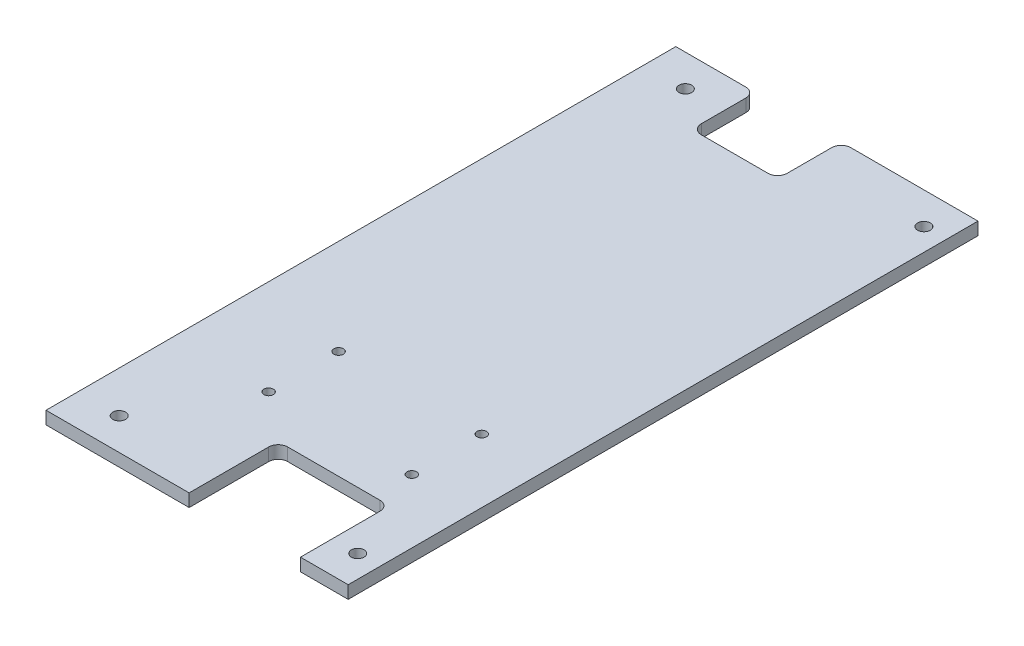
ISO-10303-21;
HEADER;
FILE_DESCRIPTION(('STEP AP214'),'2;1');
FILE_NAME('part.step','',(''),(''),'','','');
FILE_SCHEMA(('AUTOMOTIVE_DESIGN { 1 0 10303 214 1 1 1 1 }'));
ENDSEC;
DATA;
#1=APPLICATION_CONTEXT('core data for automotive mechanical design processes');
#2=APPLICATION_PROTOCOL_DEFINITION('international standard','automotive_design',2000,#1);
#3=PRODUCT_CONTEXT('',#1,'mechanical');
#4=PRODUCT('Part','Part','',(#3));
#5=PRODUCT_RELATED_PRODUCT_CATEGORY('part','',(#4));
#6=PRODUCT_DEFINITION_FORMATION('','',#4);
#7=PRODUCT_DEFINITION_CONTEXT('part definition',#1,'design');
#8=PRODUCT_DEFINITION('design','',#6,#7);
#9=PRODUCT_DEFINITION_SHAPE('','',#8);
#10=(LENGTH_UNIT() NAMED_UNIT(*) SI_UNIT(.MILLI.,.METRE.));
#11=(NAMED_UNIT(*) PLANE_ANGLE_UNIT() SI_UNIT($,.RADIAN.));
#12=(NAMED_UNIT(*) SI_UNIT($,.STERADIAN.) SOLID_ANGLE_UNIT());
#13=UNCERTAINTY_MEASURE_WITH_UNIT(LENGTH_MEASURE(1.E-05),#10,'distance_accuracy_value','');
#14=(GEOMETRIC_REPRESENTATION_CONTEXT(3) GLOBAL_UNCERTAINTY_ASSIGNED_CONTEXT((#13)) GLOBAL_UNIT_ASSIGNED_CONTEXT((#10,
#11,#12)) REPRESENTATION_CONTEXT('',''));
#15=CARTESIAN_POINT('',(0.,0.,0.));
#16=DIRECTION('',(0.,0.,1.));
#17=DIRECTION('',(1.,0.,0.));
#18=AXIS2_PLACEMENT_3D('',#15,#16,#17);
#19=CARTESIAN_POINT('',(47.5,4.,-99.));
#20=DIRECTION('',(0.,0.,1.));
#21=DIRECTION('',(1.,0.,0.));
#22=AXIS2_PLACEMENT_3D('',#19,#20,#21);
#23=PLANE('',#22);
#24=DIRECTION('',(-1.,0.,0.));
#25=VECTOR('',#24,1.);
#26=CARTESIAN_POINT('',(47.5,0.,-99.));
#27=LINE('',#26,#25);
#28=CARTESIAN_POINT('',(47.5,0.,-99.));
#29=VERTEX_POINT('',#28);
#30=CARTESIAN_POINT('',(7.50000000000001,0.,-99.));
#31=VERTEX_POINT('',#30);
#32=EDGE_CURVE('E209',#29,#31,#27,.T.);
#33=ORIENTED_EDGE('',*,*,#32,.T.);
#34=DIRECTION('',(0.,1.,0.));
#35=VECTOR('',#34,1.);
#36=CARTESIAN_POINT('',(7.50000000000001,4.,-99.));
#37=LINE('',#36,#35);
#38=CARTESIAN_POINT('',(7.50000000000001,4.,-99.));
#39=VERTEX_POINT('',#38);
#40=EDGE_CURVE('E294',#31,#39,#37,.T.);
#41=ORIENTED_EDGE('',*,*,#40,.T.);
#42=DIRECTION('',(-1.,0.,0.));
#43=VECTOR('',#42,1.);
#44=CARTESIAN_POINT('',(47.5,4.,-99.));
#45=LINE('',#44,#43);
#46=CARTESIAN_POINT('',(47.5,4.,-99.));
#47=VERTEX_POINT('',#46);
#48=EDGE_CURVE('E218',#47,#39,#45,.T.);
#49=ORIENTED_EDGE('',*,*,#48,.F.);
#50=DIRECTION('',(0.,-1.,0.));
#51=VECTOR('',#50,1.);
#52=CARTESIAN_POINT('',(47.5,4.,-99.));
#53=LINE('',#52,#51);
#54=EDGE_CURVE('E217',#47,#29,#53,.T.);
#55=ORIENTED_EDGE('',*,*,#54,.T.);
#56=EDGE_LOOP('',(#33,#41,#49,#55));
#57=FACE_BOUND('',#56,.T.);
#58=ADVANCED_FACE('F39',(#57),#23,.F.);
#59=CARTESIAN_POINT('',(47.5,4.,99.));
#60=DIRECTION('',(0.,0.,-1.));
#61=DIRECTION('',(-1.,0.,0.));
#62=AXIS2_PLACEMENT_3D('',#59,#60,#61);
#63=PLANE('',#62);
#64=DIRECTION('',(1.,0.,0.));
#65=VECTOR('',#64,1.);
#66=CARTESIAN_POINT('',(47.5,0.,99.));
#67=LINE('',#66,#65);
#68=CARTESIAN_POINT('',(-47.5,0.,99.));
#69=VERTEX_POINT('',#68);
#70=CARTESIAN_POINT('',(-2.50000000000001,0.,99.));
#71=VERTEX_POINT('',#70);
#72=EDGE_CURVE('E196',#69,#71,#67,.T.);
#73=ORIENTED_EDGE('',*,*,#72,.T.);
#74=DIRECTION('',(0.,1.,0.));
#75=VECTOR('',#74,1.);
#76=CARTESIAN_POINT('',(-2.50000000000001,0.,99.));
#77=LINE('',#76,#75);
#78=CARTESIAN_POINT('',(-2.50000000000001,4.,99.));
#79=VERTEX_POINT('',#78);
#80=EDGE_CURVE('E188',#71,#79,#77,.T.);
#81=ORIENTED_EDGE('',*,*,#80,.T.);
#82=DIRECTION('',(1.,0.,0.));
#83=VECTOR('',#82,1.);
#84=CARTESIAN_POINT('',(47.5,4.,99.));
#85=LINE('',#84,#83);
#86=CARTESIAN_POINT('',(-47.5,4.,99.));
#87=VERTEX_POINT('',#86);
#88=EDGE_CURVE('E404',#87,#79,#85,.T.);
#89=ORIENTED_EDGE('',*,*,#88,.F.);
#90=DIRECTION('',(0.,-1.,0.));
#91=VECTOR('',#90,1.);
#92=CARTESIAN_POINT('',(-47.5,4.,99.));
#93=LINE('',#92,#91);
#94=EDGE_CURVE('E225',#87,#69,#93,.T.);
#95=ORIENTED_EDGE('',*,*,#94,.T.);
#96=EDGE_LOOP('',(#73,#81,#89,#95));
#97=FACE_BOUND('',#96,.T.);
#98=ADVANCED_FACE('F426',(#97),#63,.F.);
#99=CARTESIAN_POINT('',(-47.5,4.,99.));
#100=DIRECTION('',(1.,0.,0.));
#101=DIRECTION('',(0.,0.,-1.));
#102=AXIS2_PLACEMENT_3D('',#99,#100,#101);
#103=PLANE('',#102);
#104=DIRECTION('',(0.,0.,1.));
#105=VECTOR('',#104,1.);
#106=CARTESIAN_POINT('',(-47.5,0.,99.));
#107=LINE('',#106,#105);
#108=CARTESIAN_POINT('',(-47.5,0.,-99.));
#109=VERTEX_POINT('',#108);
#110=EDGE_CURVE('E197',#109,#69,#107,.T.);
#111=ORIENTED_EDGE('',*,*,#110,.T.);
#112=ORIENTED_EDGE('',*,*,#94,.F.);
#113=DIRECTION('',(0.,0.,1.));
#114=VECTOR('',#113,1.);
#115=CARTESIAN_POINT('',(-47.5,4.,99.));
#116=LINE('',#115,#114);
#117=CARTESIAN_POINT('',(-47.5,4.,-99.));
#118=VERTEX_POINT('',#117);
#119=EDGE_CURVE('E212',#118,#87,#116,.T.);
#120=ORIENTED_EDGE('',*,*,#119,.F.);
#121=DIRECTION('',(0.,-1.,0.));
#122=VECTOR('',#121,1.);
#123=CARTESIAN_POINT('',(-47.5,4.,-99.));
#124=LINE('',#123,#122);
#125=EDGE_CURVE('E213',#118,#109,#124,.T.);
#126=ORIENTED_EDGE('',*,*,#125,.T.);
#127=EDGE_LOOP('',(#111,#112,#120,#126));
#128=FACE_BOUND('',#127,.T.);
#129=ADVANCED_FACE('F424',(#128),#103,.F.);
#130=CARTESIAN_POINT('',(32.5,4.,99.));
#131=VERTEX_POINT('',#130);
#132=CARTESIAN_POINT('',(47.5,4.,99.));
#133=VERTEX_POINT('',#132);
#134=EDGE_CURVE('E186',#131,#133,#85,.T.);
#135=ORIENTED_EDGE('',*,*,#134,.F.);
#136=DIRECTION('',(0.,1.,0.));
#137=VECTOR('',#136,1.);
#138=CARTESIAN_POINT('',(32.5,0.,99.));
#139=LINE('',#138,#137);
#140=CARTESIAN_POINT('',(32.5,0.,99.));
#141=VERTEX_POINT('',#140);
#142=EDGE_CURVE('E170',#141,#131,#139,.T.);
#143=ORIENTED_EDGE('',*,*,#142,.F.);
#144=CARTESIAN_POINT('',(47.5,0.,99.));
#145=VERTEX_POINT('',#144);
#146=EDGE_CURVE('E184',#141,#145,#67,.T.);
#147=ORIENTED_EDGE('',*,*,#146,.T.);
#148=DIRECTION('',(0.,-1.,0.));
#149=VECTOR('',#148,1.);
#150=CARTESIAN_POINT('',(47.5,4.,99.));
#151=LINE('',#150,#149);
#152=EDGE_CURVE('E222',#133,#145,#151,.T.);
#153=ORIENTED_EDGE('',*,*,#152,.F.);
#154=EDGE_LOOP('',(#135,#143,#147,#153));
#155=FACE_BOUND('',#154,.T.);
#156=ADVANCED_FACE('F182',(#155),#63,.F.);
#157=CARTESIAN_POINT('',(47.5,4.,99.));
#158=DIRECTION('',(-1.,0.,0.));
#159=DIRECTION('',(0.,0.,1.));
#160=AXIS2_PLACEMENT_3D('',#157,#158,#159);
#161=PLANE('',#160);
#162=DIRECTION('',(0.,0.,-1.));
#163=VECTOR('',#162,1.);
#164=CARTESIAN_POINT('',(47.5,0.,99.));
#165=LINE('',#164,#163);
#166=EDGE_CURVE('E194',#145,#29,#165,.T.);
#167=ORIENTED_EDGE('',*,*,#166,.T.);
#168=ORIENTED_EDGE('',*,*,#54,.F.);
#169=DIRECTION('',(0.,0.,-1.));
#170=VECTOR('',#169,1.);
#171=CARTESIAN_POINT('',(47.5,4.,99.));
#172=LINE('',#171,#170);
#173=EDGE_CURVE('E408',#133,#47,#172,.T.);
#174=ORIENTED_EDGE('',*,*,#173,.F.);
#175=ORIENTED_EDGE('',*,*,#152,.T.);
#176=EDGE_LOOP('',(#167,#168,#174,#175));
#177=FACE_BOUND('',#176,.T.);
#178=ADVANCED_FACE('F448',(#177),#161,.F.);
#179=CARTESIAN_POINT('',(-25.5,4.,-99.));
#180=VERTEX_POINT('',#179);
#181=EDGE_CURVE('E410',#180,#118,#45,.T.);
#182=ORIENTED_EDGE('',*,*,#181,.F.);
#183=DIRECTION('',(0.,1.,0.));
#184=VECTOR('',#183,1.);
#185=CARTESIAN_POINT('',(-25.5,4.,-99.));
#186=LINE('',#185,#184);
#187=CARTESIAN_POINT('',(-25.5,0.,-99.));
#188=VERTEX_POINT('',#187);
#189=EDGE_CURVE('E286',#180,#188,#186,.F.);
#190=ORIENTED_EDGE('',*,*,#189,.T.);
#191=EDGE_CURVE('E208',#188,#109,#27,.T.);
#192=ORIENTED_EDGE('',*,*,#191,.T.);
#193=ORIENTED_EDGE('',*,*,#125,.F.);
#194=EDGE_LOOP('',(#182,#190,#192,#193));
#195=FACE_BOUND('',#194,.T.);
#196=ADVANCED_FACE('F421',(#195),#23,.F.);
#197=CARTESIAN_POINT('',(0.,4.,0.));
#198=DIRECTION('',(0.,1.,0.));
#199=DIRECTION('',(0.,0.,1.));
#200=AXIS2_PLACEMENT_3D('',#197,#198,#199);
#201=PLANE('',#200);
#202=CARTESIAN_POINT('',(27.5,4.,59.));
#203=DIRECTION('',(0.,1.,0.));
#204=DIRECTION('',(0.,0.,1.));
#205=AXIS2_PLACEMENT_3D('',#202,#203,#204);
#206=CIRCLE('',#205,1.5);
#207=CARTESIAN_POINT('',(27.5,4.,60.5));
#208=VERTEX_POINT('',#207);
#209=EDGE_CURVE('E241',#208,#208,#206,.T.);
#210=ORIENTED_EDGE('',*,*,#209,.F.);
#211=EDGE_LOOP('',(#210));
#212=FACE_BOUND('',#211,.T.);
#213=CARTESIAN_POINT('',(27.5,4.,37.));
#214=DIRECTION('',(0.,1.,0.));
#215=DIRECTION('',(0.,0.,1.));
#216=AXIS2_PLACEMENT_3D('',#213,#214,#215);
#217=CIRCLE('',#216,1.5);
#218=CARTESIAN_POINT('',(27.5,4.,38.5));
#219=VERTEX_POINT('',#218);
#220=EDGE_CURVE('E726',#219,#219,#217,.T.);
#221=ORIENTED_EDGE('',*,*,#220,.F.);
#222=EDGE_LOOP('',(#221));
#223=FACE_BOUND('',#222,.T.);
#224=CARTESIAN_POINT('',(-17.5,4.,37.));
#225=DIRECTION('',(0.,1.,0.));
#226=DIRECTION('',(0.,0.,1.));
#227=AXIS2_PLACEMENT_3D('',#224,#225,#226);
#228=CIRCLE('',#227,1.5);
#229=CARTESIAN_POINT('',(-17.5,4.,38.5));
#230=VERTEX_POINT('',#229);
#231=EDGE_CURVE('E714',#230,#230,#228,.T.);
#232=ORIENTED_EDGE('',*,*,#231,.F.);
#233=EDGE_LOOP('',(#232));
#234=FACE_BOUND('',#233,.T.);
#235=CARTESIAN_POINT('',(-17.5,4.,59.));
#236=DIRECTION('',(0.,1.,0.));
#237=DIRECTION('',(0.,0.,1.));
#238=AXIS2_PLACEMENT_3D('',#235,#236,#237);
#239=CIRCLE('',#238,1.5);
#240=CARTESIAN_POINT('',(-17.5,4.,60.5));
#241=VERTEX_POINT('',#240);
#242=EDGE_CURVE('E235',#241,#241,#239,.T.);
#243=ORIENTED_EDGE('',*,*,#242,.F.);
#244=EDGE_LOOP('',(#243));
#245=FACE_BOUND('',#244,.T.);
#246=DIRECTION('',(0.,0.,1.));
#247=VECTOR('',#246,1.);
#248=CARTESIAN_POINT('',(-22.5,4.,-99.));
#249=LINE('',#248,#247);
#250=CARTESIAN_POINT('',(-22.5,4.,-96.));
#251=VERTEX_POINT('',#250);
#252=CARTESIAN_POINT('',(-22.5,4.,-82.));
#253=VERTEX_POINT('',#252);
#254=EDGE_CURVE('E234',#251,#253,#249,.T.);
#255=ORIENTED_EDGE('',*,*,#254,.F.);
#256=CARTESIAN_POINT('',(-25.5,4.,-96.));
#257=DIRECTION('',(0.,1.,0.));
#258=DIRECTION('',(0.,0.,1.));
#259=AXIS2_PLACEMENT_3D('',#256,#257,#258);
#260=CIRCLE('',#259,3.);
#261=EDGE_CURVE('E283',#251,#180,#260,.T.);
#262=ORIENTED_EDGE('',*,*,#261,.T.);
#263=ORIENTED_EDGE('',*,*,#181,.T.);
#264=ORIENTED_EDGE('',*,*,#119,.T.);
#265=ORIENTED_EDGE('',*,*,#88,.T.);
#266=DIRECTION('',(0.,0.,1.));
#267=VECTOR('',#266,1.);
#268=CARTESIAN_POINT('',(-2.50000000000001,4.,71.));
#269=LINE('',#268,#267);
#270=CARTESIAN_POINT('',(-2.50000000000001,4.,74.));
#271=VERTEX_POINT('',#270);
#272=EDGE_CURVE('E178',#271,#79,#269,.T.);
#273=ORIENTED_EDGE('',*,*,#272,.F.);
#274=CARTESIAN_POINT('',(0.499999999999991,4.,74.));
#275=DIRECTION('',(0.,1.,0.));
#276=DIRECTION('',(0.,0.,1.));
#277=AXIS2_PLACEMENT_3D('',#274,#275,#276);
#278=CIRCLE('',#277,3.);
#279=CARTESIAN_POINT('',(0.499999999999994,4.,71.));
#280=VERTEX_POINT('',#279);
#281=EDGE_CURVE('E267',#271,#280,#278,.F.);
#282=ORIENTED_EDGE('',*,*,#281,.T.);
#283=DIRECTION('',(-1.,0.,0.));
#284=VECTOR('',#283,1.);
#285=CARTESIAN_POINT('',(32.5,4.,71.));
#286=LINE('',#285,#284);
#287=CARTESIAN_POINT('',(29.5,4.,71.));
#288=VERTEX_POINT('',#287);
#289=EDGE_CURVE('E392',#288,#280,#286,.T.);
#290=ORIENTED_EDGE('',*,*,#289,.F.);
#291=CARTESIAN_POINT('',(29.5,4.,74.));
#292=DIRECTION('',(0.,1.,0.));
#293=DIRECTION('',(0.,0.,1.));
#294=AXIS2_PLACEMENT_3D('',#291,#292,#293);
#295=CIRCLE('',#294,3.);
#296=CARTESIAN_POINT('',(32.5,4.,74.));
#297=VERTEX_POINT('',#296);
#298=EDGE_CURVE('E261',#288,#297,#295,.F.);
#299=ORIENTED_EDGE('',*,*,#298,.T.);
#300=DIRECTION('',(0.,0.,-1.));
#301=VECTOR('',#300,1.);
#302=CARTESIAN_POINT('',(32.5,4.,99.));
#303=LINE('',#302,#301);
#304=EDGE_CURVE('E381',#131,#297,#303,.T.);
#305=ORIENTED_EDGE('',*,*,#304,.F.);
#306=ORIENTED_EDGE('',*,*,#134,.T.);
#307=ORIENTED_EDGE('',*,*,#173,.T.);
#308=ORIENTED_EDGE('',*,*,#48,.T.);
#309=CARTESIAN_POINT('',(7.50000000000001,4.,-96.));
#310=DIRECTION('',(0.,1.,0.));
#311=DIRECTION('',(0.,0.,1.));
#312=AXIS2_PLACEMENT_3D('',#309,#310,#311);
#313=CIRCLE('',#312,3.);
#314=CARTESIAN_POINT('',(4.5,4.,-96.));
#315=VERTEX_POINT('',#314);
#316=EDGE_CURVE('E280',#39,#315,#313,.T.);
#317=ORIENTED_EDGE('',*,*,#316,.T.);
#318=DIRECTION('',(0.,0.,-1.));
#319=VECTOR('',#318,1.);
#320=CARTESIAN_POINT('',(4.5,4.,-79.));
#321=LINE('',#320,#319);
#322=CARTESIAN_POINT('',(4.5,4.,-82.));
#323=VERTEX_POINT('',#322);
#324=EDGE_CURVE('E325',#323,#315,#321,.T.);
#325=ORIENTED_EDGE('',*,*,#324,.F.);
#326=CARTESIAN_POINT('',(1.5,4.,-82.));
#327=DIRECTION('',(0.,1.,0.));
#328=DIRECTION('',(0.,0.,1.));
#329=AXIS2_PLACEMENT_3D('',#326,#327,#328);
#330=CIRCLE('',#329,3.);
#331=CARTESIAN_POINT('',(1.5,4.,-79.));
#332=VERTEX_POINT('',#331);
#333=EDGE_CURVE('E48',#323,#332,#330,.F.);
#334=ORIENTED_EDGE('',*,*,#333,.T.);
#335=DIRECTION('',(1.,0.,0.));
#336=VECTOR('',#335,1.);
#337=CARTESIAN_POINT('',(-22.5,4.,-79.));
#338=LINE('',#337,#336);
#339=CARTESIAN_POINT('',(-19.5,4.,-79.));
#340=VERTEX_POINT('',#339);
#341=EDGE_CURVE('E324',#340,#332,#338,.T.);
#342=ORIENTED_EDGE('',*,*,#341,.F.);
#343=CARTESIAN_POINT('',(-19.5,4.,-82.));
#344=DIRECTION('',(0.,1.,0.));
#345=DIRECTION('',(0.,0.,1.));
#346=AXIS2_PLACEMENT_3D('',#343,#344,#345);
#347=CIRCLE('',#346,3.);
#348=EDGE_CURVE('E311',#340,#253,#347,.F.);
#349=ORIENTED_EDGE('',*,*,#348,.T.);
#350=EDGE_LOOP('',(#255,#262,#263,#264,#265,#273,#282,#290,#299,#305,#306,#307,#308,#317,#325,
#334,#342,#349));
#351=FACE_BOUND('',#350,.T.);
#352=CARTESIAN_POINT('',(-34.5,4.,-89.));
#353=DIRECTION('',(0.,1.,0.));
#354=DIRECTION('',(0.,0.,1.));
#355=AXIS2_PLACEMENT_3D('',#352,#353,#354);
#356=CIRCLE('',#355,2.);
#357=CARTESIAN_POINT('',(-34.5,4.,-87.));
#358=VERTEX_POINT('',#357);
#359=EDGE_CURVE('E362',#358,#358,#356,.T.);
#360=ORIENTED_EDGE('',*,*,#359,.F.);
#361=EDGE_LOOP('',(#360));
#362=FACE_BOUND('',#361,.T.);
#363=CARTESIAN_POINT('',(-34.5,4.,89.));
#364=DIRECTION('',(0.,1.,0.));
#365=DIRECTION('',(0.,0.,1.));
#366=AXIS2_PLACEMENT_3D('',#363,#364,#365);
#367=CIRCLE('',#366,2.);
#368=CARTESIAN_POINT('',(-34.5,4.,91.));
#369=VERTEX_POINT('',#368);
#370=EDGE_CURVE('E341',#369,#369,#367,.T.);
#371=ORIENTED_EDGE('',*,*,#370,.F.);
#372=EDGE_LOOP('',(#371));
#373=FACE_BOUND('',#372,.T.);
#374=CARTESIAN_POINT('',(40.5,4.,-89.));
#375=DIRECTION('',(0.,1.,0.));
#376=DIRECTION('',(0.,0.,1.));
#377=AXIS2_PLACEMENT_3D('',#374,#375,#376);
#378=CIRCLE('',#377,2.);
#379=CARTESIAN_POINT('',(40.5,4.,-87.));
#380=VERTEX_POINT('',#379);
#381=EDGE_CURVE('E361',#380,#380,#378,.T.);
#382=ORIENTED_EDGE('',*,*,#381,.F.);
#383=EDGE_LOOP('',(#382));
#384=FACE_BOUND('',#383,.T.);
#385=CARTESIAN_POINT('',(40.5,4.,89.));
#386=DIRECTION('',(0.,1.,0.));
#387=DIRECTION('',(0.,0.,1.));
#388=AXIS2_PLACEMENT_3D('',#385,#386,#387);
#389=CIRCLE('',#388,2.);
#390=CARTESIAN_POINT('',(40.5,4.,91.));
#391=VERTEX_POINT('',#390);
#392=EDGE_CURVE('E373',#391,#391,#389,.T.);
#393=ORIENTED_EDGE('',*,*,#392,.F.);
#394=EDGE_LOOP('',(#393));
#395=FACE_BOUND('',#394,.T.);
#396=ADVANCED_FACE('F322',(#212,#223,#234,#245,#351,#362,#373,#384,#395),#201,.T.);
#397=CARTESIAN_POINT('',(0.,0.,0.));
#398=DIRECTION('',(0.,1.,0.));
#399=DIRECTION('',(0.,0.,1.));
#400=AXIS2_PLACEMENT_3D('',#397,#398,#399);
#401=PLANE('',#400);
#402=CARTESIAN_POINT('',(27.5,0.,59.));
#403=DIRECTION('',(0.,1.,0.));
#404=DIRECTION('',(0.,0.,1.));
#405=AXIS2_PLACEMENT_3D('',#402,#403,#404);
#406=CIRCLE('',#405,1.5);
#407=CARTESIAN_POINT('',(27.5,0.,60.5));
#408=VERTEX_POINT('',#407);
#409=EDGE_CURVE('E245',#408,#408,#406,.T.);
#410=ORIENTED_EDGE('',*,*,#409,.T.);
#411=EDGE_LOOP('',(#410));
#412=FACE_BOUND('',#411,.T.);
#413=CARTESIAN_POINT('',(27.5,0.,37.));
#414=DIRECTION('',(0.,1.,0.));
#415=DIRECTION('',(0.,0.,1.));
#416=AXIS2_PLACEMENT_3D('',#413,#414,#415);
#417=CIRCLE('',#416,1.5);
#418=CARTESIAN_POINT('',(27.5,0.,38.5));
#419=VERTEX_POINT('',#418);
#420=EDGE_CURVE('E240',#419,#419,#417,.T.);
#421=ORIENTED_EDGE('',*,*,#420,.T.);
#422=EDGE_LOOP('',(#421));
#423=FACE_BOUND('',#422,.T.);
#424=CARTESIAN_POINT('',(-17.5,0.,37.));
#425=DIRECTION('',(0.,1.,0.));
#426=DIRECTION('',(0.,0.,1.));
#427=AXIS2_PLACEMENT_3D('',#424,#425,#426);
#428=CIRCLE('',#427,1.5);
#429=CARTESIAN_POINT('',(-17.5,0.,38.5));
#430=VERTEX_POINT('',#429);
#431=EDGE_CURVE('E236',#430,#430,#428,.T.);
#432=ORIENTED_EDGE('',*,*,#431,.T.);
#433=EDGE_LOOP('',(#432));
#434=FACE_BOUND('',#433,.T.);
#435=CARTESIAN_POINT('',(-17.5,0.,59.));
#436=DIRECTION('',(0.,1.,0.));
#437=DIRECTION('',(0.,0.,1.));
#438=AXIS2_PLACEMENT_3D('',#435,#436,#437);
#439=CIRCLE('',#438,1.5);
#440=CARTESIAN_POINT('',(-17.5,0.,60.5));
#441=VERTEX_POINT('',#440);
#442=EDGE_CURVE('E230',#441,#441,#439,.T.);
#443=ORIENTED_EDGE('',*,*,#442,.T.);
#444=EDGE_LOOP('',(#443));
#445=FACE_BOUND('',#444,.T.);
#446=CARTESIAN_POINT('',(-34.5,0.,-89.));
#447=DIRECTION('',(0.,1.,0.));
#448=DIRECTION('',(0.,0.,1.));
#449=AXIS2_PLACEMENT_3D('',#446,#447,#448);
#450=CIRCLE('',#449,2.);
#451=CARTESIAN_POINT('',(-34.5,0.,-87.));
#452=VERTEX_POINT('',#451);
#453=EDGE_CURVE('E357',#452,#452,#450,.T.);
#454=ORIENTED_EDGE('',*,*,#453,.T.);
#455=EDGE_LOOP('',(#454));
#456=FACE_BOUND('',#455,.T.);
#457=CARTESIAN_POINT('',(-34.5,0.,89.));
#458=DIRECTION('',(0.,1.,0.));
#459=DIRECTION('',(0.,0.,1.));
#460=AXIS2_PLACEMENT_3D('',#457,#458,#459);
#461=CIRCLE('',#460,2.);
#462=CARTESIAN_POINT('',(-34.5,0.,91.));
#463=VERTEX_POINT('',#462);
#464=EDGE_CURVE('E346',#463,#463,#461,.T.);
#465=ORIENTED_EDGE('',*,*,#464,.T.);
#466=EDGE_LOOP('',(#465));
#467=FACE_BOUND('',#466,.T.);
#468=CARTESIAN_POINT('',(40.5,0.,-89.));
#469=DIRECTION('',(0.,1.,0.));
#470=DIRECTION('',(0.,0.,1.));
#471=AXIS2_PLACEMENT_3D('',#468,#469,#470);
#472=CIRCLE('',#471,2.);
#473=CARTESIAN_POINT('',(40.5,0.,-87.));
#474=VERTEX_POINT('',#473);
#475=EDGE_CURVE('E369',#474,#474,#472,.T.);
#476=ORIENTED_EDGE('',*,*,#475,.T.);
#477=EDGE_LOOP('',(#476));
#478=FACE_BOUND('',#477,.T.);
#479=CARTESIAN_POINT('',(40.5,0.,89.));
#480=DIRECTION('',(0.,1.,0.));
#481=DIRECTION('',(0.,0.,1.));
#482=AXIS2_PLACEMENT_3D('',#479,#480,#481);
#483=CIRCLE('',#482,2.);
#484=CARTESIAN_POINT('',(40.5,0.,91.));
#485=VERTEX_POINT('',#484);
#486=EDGE_CURVE('E377',#485,#485,#483,.T.);
#487=ORIENTED_EDGE('',*,*,#486,.T.);
#488=EDGE_LOOP('',(#487));
#489=FACE_BOUND('',#488,.T.);
#490=ORIENTED_EDGE('',*,*,#191,.F.);
#491=CARTESIAN_POINT('',(-25.5,0.,-96.));
#492=DIRECTION('',(0.,1.,0.));
#493=DIRECTION('',(0.,0.,1.));
#494=AXIS2_PLACEMENT_3D('',#491,#492,#493);
#495=CIRCLE('',#494,3.);
#496=CARTESIAN_POINT('',(-22.5,0.,-96.));
#497=VERTEX_POINT('',#496);
#498=EDGE_CURVE('E291',#188,#497,#495,.F.);
#499=ORIENTED_EDGE('',*,*,#498,.T.);
#500=DIRECTION('',(0.,0.,1.));
#501=VECTOR('',#500,1.);
#502=CARTESIAN_POINT('',(-22.5,0.,-99.));
#503=LINE('',#502,#501);
#504=CARTESIAN_POINT('',(-22.5,0.,-82.));
#505=VERTEX_POINT('',#504);
#506=EDGE_CURVE('E348',#497,#505,#503,.T.);
#507=ORIENTED_EDGE('',*,*,#506,.T.);
#508=CARTESIAN_POINT('',(-19.5,0.,-82.));
#509=DIRECTION('',(0.,1.,0.));
#510=DIRECTION('',(0.,0.,1.));
#511=AXIS2_PLACEMENT_3D('',#508,#509,#510);
#512=CIRCLE('',#511,3.);
#513=CARTESIAN_POINT('',(-19.5,0.,-79.));
#514=VERTEX_POINT('',#513);
#515=EDGE_CURVE('E314',#505,#514,#512,.T.);
#516=ORIENTED_EDGE('',*,*,#515,.T.);
#517=DIRECTION('',(1.,0.,0.));
#518=VECTOR('',#517,1.);
#519=CARTESIAN_POINT('',(-22.5,0.,-79.));
#520=LINE('',#519,#518);
#521=CARTESIAN_POINT('',(1.5,0.,-79.));
#522=VERTEX_POINT('',#521);
#523=EDGE_CURVE('E338',#514,#522,#520,.T.);
#524=ORIENTED_EDGE('',*,*,#523,.T.);
#525=CARTESIAN_POINT('',(1.5,0.,-82.));
#526=DIRECTION('',(0.,1.,0.));
#527=DIRECTION('',(0.,0.,1.));
#528=AXIS2_PLACEMENT_3D('',#525,#526,#527);
#529=CIRCLE('',#528,3.);
#530=CARTESIAN_POINT('',(4.5,0.,-82.));
#531=VERTEX_POINT('',#530);
#532=EDGE_CURVE('E11',#522,#531,#529,.T.);
#533=ORIENTED_EDGE('',*,*,#532,.T.);
#534=DIRECTION('',(0.,0.,-1.));
#535=VECTOR('',#534,1.);
#536=CARTESIAN_POINT('',(4.5,0.,-79.));
#537=LINE('',#536,#535);
#538=CARTESIAN_POINT('',(4.5,0.,-96.));
#539=VERTEX_POINT('',#538);
#540=EDGE_CURVE('E337',#531,#539,#537,.T.);
#541=ORIENTED_EDGE('',*,*,#540,.T.);
#542=CARTESIAN_POINT('',(7.50000000000001,0.,-96.));
#543=DIRECTION('',(0.,1.,0.));
#544=DIRECTION('',(0.,0.,1.));
#545=AXIS2_PLACEMENT_3D('',#542,#543,#544);
#546=CIRCLE('',#545,3.);
#547=EDGE_CURVE('E55',#539,#31,#546,.F.);
#548=ORIENTED_EDGE('',*,*,#547,.T.);
#549=ORIENTED_EDGE('',*,*,#32,.F.);
#550=ORIENTED_EDGE('',*,*,#166,.F.);
#551=ORIENTED_EDGE('',*,*,#146,.F.);
#552=DIRECTION('',(0.,0.,-1.));
#553=VECTOR('',#552,1.);
#554=CARTESIAN_POINT('',(32.5,0.,99.));
#555=LINE('',#554,#553);
#556=CARTESIAN_POINT('',(32.5,0.,74.));
#557=VERTEX_POINT('',#556);
#558=EDGE_CURVE('E166',#141,#557,#555,.T.);
#559=ORIENTED_EDGE('',*,*,#558,.T.);
#560=CARTESIAN_POINT('',(29.5,0.,74.));
#561=DIRECTION('',(0.,1.,0.));
#562=DIRECTION('',(0.,0.,1.));
#563=AXIS2_PLACEMENT_3D('',#560,#561,#562);
#564=CIRCLE('',#563,3.);
#565=CARTESIAN_POINT('',(29.5,0.,71.));
#566=VERTEX_POINT('',#565);
#567=EDGE_CURVE('E264',#557,#566,#564,.T.);
#568=ORIENTED_EDGE('',*,*,#567,.T.);
#569=DIRECTION('',(-1.,0.,0.));
#570=VECTOR('',#569,1.);
#571=CARTESIAN_POINT('',(32.5,0.,71.));
#572=LINE('',#571,#570);
#573=CARTESIAN_POINT('',(0.499999999999994,0.,71.));
#574=VERTEX_POINT('',#573);
#575=EDGE_CURVE('E177',#566,#574,#572,.T.);
#576=ORIENTED_EDGE('',*,*,#575,.T.);
#577=CARTESIAN_POINT('',(0.499999999999991,0.,74.));
#578=DIRECTION('',(0.,1.,0.));
#579=DIRECTION('',(0.,0.,1.));
#580=AXIS2_PLACEMENT_3D('',#577,#578,#579);
#581=CIRCLE('',#580,3.);
#582=CARTESIAN_POINT('',(-2.50000000000001,0.,74.));
#583=VERTEX_POINT('',#582);
#584=EDGE_CURVE('E270',#574,#583,#581,.T.);
#585=ORIENTED_EDGE('',*,*,#584,.T.);
#586=DIRECTION('',(0.,0.,1.));
#587=VECTOR('',#586,1.);
#588=CARTESIAN_POINT('',(-2.50000000000001,0.,71.));
#589=LINE('',#588,#587);
#590=EDGE_CURVE('E189',#583,#71,#589,.T.);
#591=ORIENTED_EDGE('',*,*,#590,.T.);
#592=ORIENTED_EDGE('',*,*,#72,.F.);
#593=ORIENTED_EDGE('',*,*,#110,.F.);
#594=EDGE_LOOP('',(#490,#499,#507,#516,#524,#533,#541,#548,#549,#550,#551,#559,#568,#576,#585,
#591,#592,#593));
#595=FACE_BOUND('',#594,.T.);
#596=ADVANCED_FACE('F193',(#412,#423,#434,#445,#456,#467,#478,#489,#595),#401,.F.);
#597=CARTESIAN_POINT('',(-2.50000000000001,0.,71.));
#598=DIRECTION('',(-1.,0.,0.));
#599=DIRECTION('',(0.,0.,1.));
#600=AXIS2_PLACEMENT_3D('',#597,#598,#599);
#601=PLANE('',#600);
#602=ORIENTED_EDGE('',*,*,#590,.F.);
#603=DIRECTION('',(0.,1.,0.));
#604=VECTOR('',#603,1.);
#605=CARTESIAN_POINT('',(-2.50000000000001,4.,74.));
#606=LINE('',#605,#604);
#607=EDGE_CURVE('E257',#583,#271,#606,.T.);
#608=ORIENTED_EDGE('',*,*,#607,.T.);
#609=ORIENTED_EDGE('',*,*,#272,.T.);
#610=ORIENTED_EDGE('',*,*,#80,.F.);
#611=EDGE_LOOP('',(#602,#608,#609,#610));
#612=FACE_BOUND('',#611,.T.);
#613=ADVANCED_FACE('F432',(#612),#601,.F.);
#614=CARTESIAN_POINT('',(32.5,0.,71.));
#615=DIRECTION('',(0.,0.,-1.));
#616=DIRECTION('',(-1.,0.,0.));
#617=AXIS2_PLACEMENT_3D('',#614,#615,#616);
#618=PLANE('',#617);
#619=ORIENTED_EDGE('',*,*,#575,.F.);
#620=DIRECTION('',(0.,1.,0.));
#621=VECTOR('',#620,1.);
#622=CARTESIAN_POINT('',(29.5,4.,71.));
#623=LINE('',#622,#621);
#624=EDGE_CURVE('E251',#566,#288,#623,.T.);
#625=ORIENTED_EDGE('',*,*,#624,.T.);
#626=ORIENTED_EDGE('',*,*,#289,.T.);
#627=DIRECTION('',(0.,1.,0.));
#628=VECTOR('',#627,1.);
#629=CARTESIAN_POINT('',(0.499999999999991,0.,71.));
#630=LINE('',#629,#628);
#631=EDGE_CURVE('E229',#280,#574,#630,.F.);
#632=ORIENTED_EDGE('',*,*,#631,.T.);
#633=EDGE_LOOP('',(#619,#625,#626,#632));
#634=FACE_BOUND('',#633,.T.);
#635=ADVANCED_FACE('F440',(#634),#618,.F.);
#636=CARTESIAN_POINT('',(32.5,0.,99.));
#637=DIRECTION('',(1.,0.,0.));
#638=DIRECTION('',(0.,0.,-1.));
#639=AXIS2_PLACEMENT_3D('',#636,#637,#638);
#640=PLANE('',#639);
#641=ORIENTED_EDGE('',*,*,#304,.T.);
#642=DIRECTION('',(0.,1.,0.));
#643=VECTOR('',#642,1.);
#644=CARTESIAN_POINT('',(32.5,0.,74.));
#645=LINE('',#644,#643);
#646=EDGE_CURVE('E173',#297,#557,#645,.F.);
#647=ORIENTED_EDGE('',*,*,#646,.T.);
#648=ORIENTED_EDGE('',*,*,#558,.F.);
#649=ORIENTED_EDGE('',*,*,#142,.T.);
#650=EDGE_LOOP('',(#641,#647,#648,#649));
#651=FACE_BOUND('',#650,.T.);
#652=ADVANCED_FACE('F169',(#651),#640,.F.);
#653=CARTESIAN_POINT('',(40.5,0.,89.));
#654=DIRECTION('',(0.,1.,0.));
#655=DIRECTION('',(0.,0.,1.));
#656=AXIS2_PLACEMENT_3D('',#653,#654,#655);
#657=CYLINDRICAL_SURFACE('',#656,2.);
#658=ORIENTED_EDGE('',*,*,#486,.F.);
#659=EDGE_LOOP('',(#658));
#660=FACE_BOUND('',#659,.T.);
#661=ORIENTED_EDGE('',*,*,#392,.T.);
#662=EDGE_LOOP('',(#661));
#663=FACE_BOUND('',#662,.T.);
#664=ADVANCED_FACE('F599',(#660,#663),#657,.F.);
#665=CARTESIAN_POINT('',(40.5,0.,-89.));
#666=DIRECTION('',(0.,1.,0.));
#667=DIRECTION('',(0.,0.,1.));
#668=AXIS2_PLACEMENT_3D('',#665,#666,#667);
#669=CYLINDRICAL_SURFACE('',#668,2.);
#670=ORIENTED_EDGE('',*,*,#475,.F.);
#671=EDGE_LOOP('',(#670));
#672=FACE_BOUND('',#671,.T.);
#673=ORIENTED_EDGE('',*,*,#381,.T.);
#674=EDGE_LOOP('',(#673));
#675=FACE_BOUND('',#674,.T.);
#676=ADVANCED_FACE('F590',(#672,#675),#669,.F.);
#677=CARTESIAN_POINT('',(-34.5,0.,89.));
#678=DIRECTION('',(0.,1.,0.));
#679=DIRECTION('',(0.,0.,1.));
#680=AXIS2_PLACEMENT_3D('',#677,#678,#679);
#681=CYLINDRICAL_SURFACE('',#680,2.);
#682=ORIENTED_EDGE('',*,*,#464,.F.);
#683=EDGE_LOOP('',(#682));
#684=FACE_BOUND('',#683,.T.);
#685=ORIENTED_EDGE('',*,*,#370,.T.);
#686=EDGE_LOOP('',(#685));
#687=FACE_BOUND('',#686,.T.);
#688=ADVANCED_FACE('F580',(#684,#687),#681,.F.);
#689=CARTESIAN_POINT('',(-34.5,0.,-89.));
#690=DIRECTION('',(0.,1.,0.));
#691=DIRECTION('',(0.,0.,1.));
#692=AXIS2_PLACEMENT_3D('',#689,#690,#691);
#693=CYLINDRICAL_SURFACE('',#692,2.);
#694=ORIENTED_EDGE('',*,*,#453,.F.);
#695=EDGE_LOOP('',(#694));
#696=FACE_BOUND('',#695,.T.);
#697=ORIENTED_EDGE('',*,*,#359,.T.);
#698=EDGE_LOOP('',(#697));
#699=FACE_BOUND('',#698,.T.);
#700=ADVANCED_FACE('F545',(#696,#699),#693,.F.);
#701=CARTESIAN_POINT('',(4.5,0.,-79.));
#702=DIRECTION('',(1.,0.,0.));
#703=DIRECTION('',(0.,0.,-1.));
#704=AXIS2_PLACEMENT_3D('',#701,#702,#703);
#705=PLANE('',#704);
#706=ORIENTED_EDGE('',*,*,#324,.T.);
#707=DIRECTION('',(0.,1.,0.));
#708=VECTOR('',#707,1.);
#709=CARTESIAN_POINT('',(4.5,0.,-96.));
#710=LINE('',#709,#708);
#711=EDGE_CURVE('E63',#315,#539,#710,.F.);
#712=ORIENTED_EDGE('',*,*,#711,.T.);
#713=ORIENTED_EDGE('',*,*,#540,.F.);
#714=DIRECTION('',(0.,1.,0.));
#715=VECTOR('',#714,1.);
#716=CARTESIAN_POINT('',(4.5,4.,-82.));
#717=LINE('',#716,#715);
#718=EDGE_CURVE('E298',#531,#323,#717,.T.);
#719=ORIENTED_EDGE('',*,*,#718,.T.);
#720=EDGE_LOOP('',(#706,#712,#713,#719));
#721=FACE_BOUND('',#720,.T.);
#722=ADVANCED_FACE('F339',(#721),#705,.F.);
#723=CARTESIAN_POINT('',(-22.5,0.,-79.));
#724=DIRECTION('',(0.,0.,1.));
#725=DIRECTION('',(1.,0.,0.));
#726=AXIS2_PLACEMENT_3D('',#723,#724,#725);
#727=PLANE('',#726);
#728=ORIENTED_EDGE('',*,*,#523,.F.);
#729=DIRECTION('',(0.,1.,0.));
#730=VECTOR('',#729,1.);
#731=CARTESIAN_POINT('',(-19.5,4.,-79.));
#732=LINE('',#731,#730);
#733=EDGE_CURVE('E307',#514,#340,#732,.T.);
#734=ORIENTED_EDGE('',*,*,#733,.T.);
#735=ORIENTED_EDGE('',*,*,#341,.T.);
#736=DIRECTION('',(0.,1.,0.));
#737=VECTOR('',#736,1.);
#738=CARTESIAN_POINT('',(1.5,0.,-79.));
#739=LINE('',#738,#737);
#740=EDGE_CURVE('E304',#332,#522,#739,.F.);
#741=ORIENTED_EDGE('',*,*,#740,.T.);
#742=EDGE_LOOP('',(#728,#734,#735,#741));
#743=FACE_BOUND('',#742,.T.);
#744=ADVANCED_FACE('F331',(#743),#727,.F.);
#745=CARTESIAN_POINT('',(-22.5,0.,-99.));
#746=DIRECTION('',(-1.,0.,0.));
#747=DIRECTION('',(0.,0.,1.));
#748=AXIS2_PLACEMENT_3D('',#745,#746,#747);
#749=PLANE('',#748);
#750=ORIENTED_EDGE('',*,*,#506,.F.);
#751=DIRECTION('',(0.,1.,0.));
#752=VECTOR('',#751,1.);
#753=CARTESIAN_POINT('',(-22.5,0.,-96.));
#754=LINE('',#753,#752);
#755=EDGE_CURVE('E276',#497,#251,#754,.T.);
#756=ORIENTED_EDGE('',*,*,#755,.T.);
#757=ORIENTED_EDGE('',*,*,#254,.T.);
#758=DIRECTION('',(0.,1.,0.));
#759=VECTOR('',#758,1.);
#760=CARTESIAN_POINT('',(-22.5,0.,-82.));
#761=LINE('',#760,#759);
#762=EDGE_CURVE('E273',#253,#505,#761,.F.);
#763=ORIENTED_EDGE('',*,*,#762,.T.);
#764=EDGE_LOOP('',(#750,#756,#757,#763));
#765=FACE_BOUND('',#764,.T.);
#766=ADVANCED_FACE('F504',(#765),#749,.F.);
#767=CARTESIAN_POINT('',(-17.5,-16.,59.));
#768=DIRECTION('',(0.,1.,0.));
#769=DIRECTION('',(0.,0.,1.));
#770=AXIS2_PLACEMENT_3D('',#767,#768,#769);
#771=CYLINDRICAL_SURFACE('',#770,1.5);
#772=ORIENTED_EDGE('',*,*,#242,.T.);
#773=EDGE_LOOP('',(#772));
#774=FACE_BOUND('',#773,.T.);
#775=ORIENTED_EDGE('',*,*,#442,.F.);
#776=EDGE_LOOP('',(#775));
#777=FACE_BOUND('',#776,.T.);
#778=ADVANCED_FACE('F525',(#774,#777),#771,.F.);
#779=CARTESIAN_POINT('',(-17.5,-16.,37.));
#780=DIRECTION('',(0.,1.,0.));
#781=DIRECTION('',(0.,0.,1.));
#782=AXIS2_PLACEMENT_3D('',#779,#780,#781);
#783=CYLINDRICAL_SURFACE('',#782,1.5);
#784=ORIENTED_EDGE('',*,*,#231,.T.);
#785=EDGE_LOOP('',(#784));
#786=FACE_BOUND('',#785,.T.);
#787=ORIENTED_EDGE('',*,*,#431,.F.);
#788=EDGE_LOOP('',(#787));
#789=FACE_BOUND('',#788,.T.);
#790=ADVANCED_FACE('F666',(#786,#789),#783,.F.);
#791=CARTESIAN_POINT('',(27.5,-16.,37.));
#792=DIRECTION('',(0.,1.,0.));
#793=DIRECTION('',(0.,0.,1.));
#794=AXIS2_PLACEMENT_3D('',#791,#792,#793);
#795=CYLINDRICAL_SURFACE('',#794,1.5);
#796=ORIENTED_EDGE('',*,*,#220,.T.);
#797=EDGE_LOOP('',(#796));
#798=FACE_BOUND('',#797,.T.);
#799=ORIENTED_EDGE('',*,*,#420,.F.);
#800=EDGE_LOOP('',(#799));
#801=FACE_BOUND('',#800,.T.);
#802=ADVANCED_FACE('F655',(#798,#801),#795,.F.);
#803=CARTESIAN_POINT('',(27.5,-16.,59.));
#804=DIRECTION('',(0.,1.,0.));
#805=DIRECTION('',(0.,0.,1.));
#806=AXIS2_PLACEMENT_3D('',#803,#804,#805);
#807=CYLINDRICAL_SURFACE('',#806,1.5);
#808=ORIENTED_EDGE('',*,*,#209,.T.);
#809=EDGE_LOOP('',(#808));
#810=FACE_BOUND('',#809,.T.);
#811=ORIENTED_EDGE('',*,*,#409,.F.);
#812=EDGE_LOOP('',(#811));
#813=FACE_BOUND('',#812,.T.);
#814=ADVANCED_FACE('F487',(#810,#813),#807,.F.);
#815=CARTESIAN_POINT('',(29.5,0.,74.));
#816=DIRECTION('',(0.,-1.,0.));
#817=DIRECTION('',(0.,0.,-1.));
#818=AXIS2_PLACEMENT_3D('',#815,#816,#817);
#819=CYLINDRICAL_SURFACE('',#818,3.);
#820=ORIENTED_EDGE('',*,*,#567,.F.);
#821=ORIENTED_EDGE('',*,*,#646,.F.);
#822=ORIENTED_EDGE('',*,*,#298,.F.);
#823=ORIENTED_EDGE('',*,*,#624,.F.);
#824=EDGE_LOOP('',(#820,#821,#822,#823));
#825=FACE_BOUND('',#824,.T.);
#826=ADVANCED_FACE('F443',(#825),#819,.F.);
#827=CARTESIAN_POINT('',(0.499999999999991,0.,74.));
#828=DIRECTION('',(0.,-1.,0.));
#829=DIRECTION('',(0.,0.,-1.));
#830=AXIS2_PLACEMENT_3D('',#827,#828,#829);
#831=CYLINDRICAL_SURFACE('',#830,3.);
#832=ORIENTED_EDGE('',*,*,#584,.F.);
#833=ORIENTED_EDGE('',*,*,#631,.F.);
#834=ORIENTED_EDGE('',*,*,#281,.F.);
#835=ORIENTED_EDGE('',*,*,#607,.F.);
#836=EDGE_LOOP('',(#832,#833,#834,#835));
#837=FACE_BOUND('',#836,.T.);
#838=ADVANCED_FACE('F436',(#837),#831,.F.);
#839=CARTESIAN_POINT('',(-25.5,0.,-96.));
#840=DIRECTION('',(0.,1.,0.));
#841=DIRECTION('',(0.,0.,1.));
#842=AXIS2_PLACEMENT_3D('',#839,#840,#841);
#843=CYLINDRICAL_SURFACE('',#842,3.);
#844=ORIENTED_EDGE('',*,*,#498,.F.);
#845=ORIENTED_EDGE('',*,*,#189,.F.);
#846=ORIENTED_EDGE('',*,*,#261,.F.);
#847=ORIENTED_EDGE('',*,*,#755,.F.);
#848=EDGE_LOOP('',(#844,#845,#846,#847));
#849=FACE_BOUND('',#848,.T.);
#850=ADVANCED_FACE('F455',(#849),#843,.T.);
#851=CARTESIAN_POINT('',(7.50000000000001,4.,-96.));
#852=DIRECTION('',(0.,1.,0.));
#853=DIRECTION('',(0.,0.,1.));
#854=AXIS2_PLACEMENT_3D('',#851,#852,#853);
#855=CYLINDRICAL_SURFACE('',#854,3.);
#856=ORIENTED_EDGE('',*,*,#547,.F.);
#857=ORIENTED_EDGE('',*,*,#711,.F.);
#858=ORIENTED_EDGE('',*,*,#316,.F.);
#859=ORIENTED_EDGE('',*,*,#40,.F.);
#860=EDGE_LOOP('',(#856,#857,#858,#859));
#861=FACE_BOUND('',#860,.T.);
#862=ADVANCED_FACE('F452',(#861),#855,.T.);
#863=CARTESIAN_POINT('',(-19.5,0.,-82.));
#864=DIRECTION('',(0.,-1.,0.));
#865=DIRECTION('',(0.,0.,-1.));
#866=AXIS2_PLACEMENT_3D('',#863,#864,#865);
#867=CYLINDRICAL_SURFACE('',#866,3.);
#868=ORIENTED_EDGE('',*,*,#515,.F.);
#869=ORIENTED_EDGE('',*,*,#762,.F.);
#870=ORIENTED_EDGE('',*,*,#348,.F.);
#871=ORIENTED_EDGE('',*,*,#733,.F.);
#872=EDGE_LOOP('',(#868,#869,#870,#871));
#873=FACE_BOUND('',#872,.T.);
#874=ADVANCED_FACE('F454',(#873),#867,.F.);
#875=CARTESIAN_POINT('',(1.5,0.,-82.));
#876=DIRECTION('',(0.,-1.,0.));
#877=DIRECTION('',(0.,0.,-1.));
#878=AXIS2_PLACEMENT_3D('',#875,#876,#877);
#879=CYLINDRICAL_SURFACE('',#878,3.);
#880=ORIENTED_EDGE('',*,*,#532,.F.);
#881=ORIENTED_EDGE('',*,*,#740,.F.);
#882=ORIENTED_EDGE('',*,*,#333,.F.);
#883=ORIENTED_EDGE('',*,*,#718,.F.);
#884=EDGE_LOOP('',(#880,#881,#882,#883));
#885=FACE_BOUND('',#884,.T.);
#886=ADVANCED_FACE('F41',(#885),#879,.F.);
#887=CLOSED_SHELL('',(#58,#98,#129,#156,#178,#196,#396,#596,#613,#635,#652,#664,#676,#688,#700,
#722,#744,#766,#778,#790,#802,#814,#826,#838,#850,#862,#874,#886));
#888=MANIFOLD_SOLID_BREP('B2',#887);
#889=ADVANCED_BREP_SHAPE_REPRESENTATION('',(#18,#888),#14);
#890=SHAPE_DEFINITION_REPRESENTATION(#9,#889);
ENDSEC;
END-ISO-10303-21;
